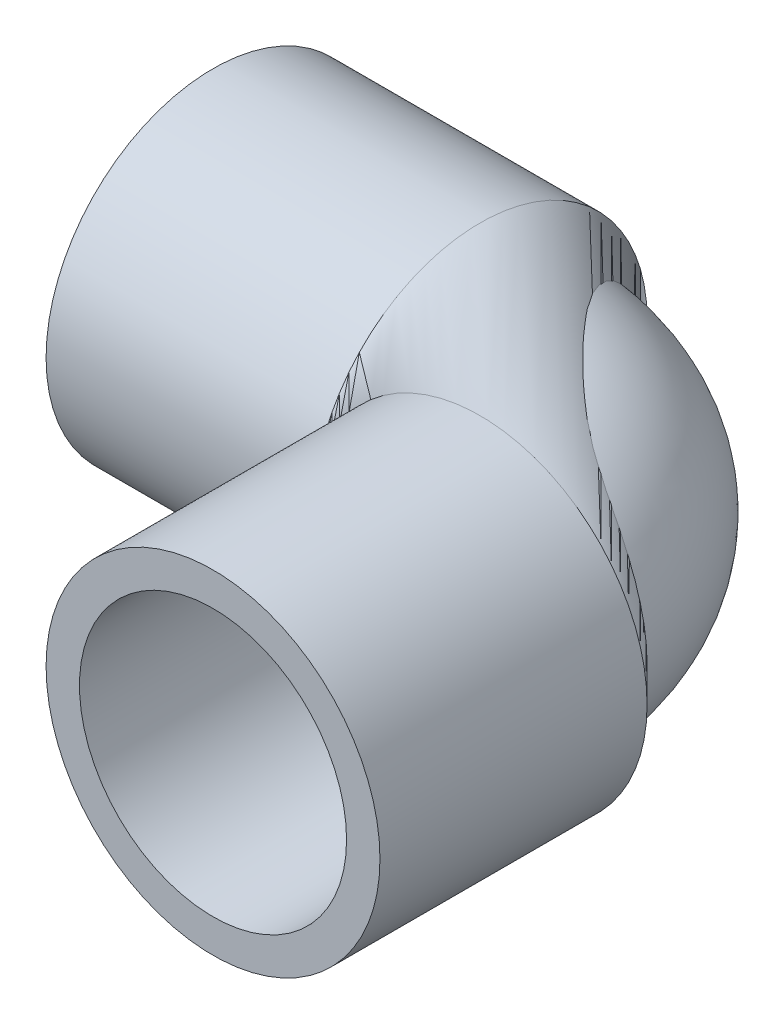
ISO-10303-21;
HEADER;
FILE_DESCRIPTION(('STEP AP214'),'2;1');
FILE_NAME('part.step','',(''),(''),'','','');
FILE_SCHEMA(('AUTOMOTIVE_DESIGN { 1 0 10303 214 1 1 1 1 }'));
ENDSEC;
DATA;
#1=APPLICATION_CONTEXT('core data for automotive mechanical design processes');
#2=APPLICATION_PROTOCOL_DEFINITION('international standard','automotive_design',2000,#1);
#3=PRODUCT_CONTEXT('',#1,'mechanical');
#4=PRODUCT('Part','Part','',(#3));
#5=PRODUCT_RELATED_PRODUCT_CATEGORY('part','',(#4));
#6=PRODUCT_DEFINITION_FORMATION('','',#4);
#7=PRODUCT_DEFINITION_CONTEXT('part definition',#1,'design');
#8=PRODUCT_DEFINITION('design','',#6,#7);
#9=PRODUCT_DEFINITION_SHAPE('','',#8);
#10=(LENGTH_UNIT() NAMED_UNIT(*) SI_UNIT(.MILLI.,.METRE.));
#11=(NAMED_UNIT(*) PLANE_ANGLE_UNIT() SI_UNIT($,.RADIAN.));
#12=(NAMED_UNIT(*) SI_UNIT($,.STERADIAN.) SOLID_ANGLE_UNIT());
#13=UNCERTAINTY_MEASURE_WITH_UNIT(LENGTH_MEASURE(1.E-05),#10,'distance_accuracy_value','');
#14=(GEOMETRIC_REPRESENTATION_CONTEXT(3) GLOBAL_UNCERTAINTY_ASSIGNED_CONTEXT((#13)) GLOBAL_UNIT_ASSIGNED_CONTEXT((#10,
#11,#12)) REPRESENTATION_CONTEXT('',''));
#15=CARTESIAN_POINT('',(0.,0.,0.));
#16=DIRECTION('',(0.,0.,1.));
#17=DIRECTION('',(1.,0.,0.));
#18=AXIS2_PLACEMENT_3D('',#15,#16,#17);
#19=CARTESIAN_POINT('',(-41.2750000000001,0.,-15.8749999999999));
#20=DIRECTION('',(1.,0.,0.));
#21=DIRECTION('',(0.,0.,-1.));
#22=AXIS2_PLACEMENT_3D('',#19,#20,#21);
#23=CYLINDRICAL_SURFACE('',#22,15.875);
#24=CARTESIAN_POINT('',(-41.2750000000001,0.,-15.8749999999999));
#25=DIRECTION('',(1.,0.,0.));
#26=DIRECTION('',(0.,0.,-1.));
#27=AXIS2_PLACEMENT_3D('',#24,#25,#26);
#28=CIRCLE('',#27,15.875);
#29=CARTESIAN_POINT('',(-41.2750000000001,0.,-31.7499999999999));
#30=VERTEX_POINT('',#29);
#31=EDGE_CURVE('E12',#30,#30,#28,.T.);
#32=ORIENTED_EDGE('',*,*,#31,.T.);
#33=EDGE_LOOP('',(#32));
#34=FACE_BOUND('',#33,.T.);
#35=CARTESIAN_POINT('',(-15.8750000000001,0.,-15.875));
#36=DIRECTION('',(1.,0.,0.));
#37=DIRECTION('',(0.,0.,-1.));
#38=AXIS2_PLACEMENT_3D('',#35,#36,#37);
#39=CIRCLE('',#38,15.875);
#40=CARTESIAN_POINT('',(-15.8750000000001,0.,-31.75));
#41=VERTEX_POINT('',#40);
#42=EDGE_CURVE('E53',#41,#41,#39,.T.);
#43=ORIENTED_EDGE('',*,*,#42,.F.);
#44=EDGE_LOOP('',(#43));
#45=FACE_BOUND('',#44,.T.);
#46=ADVANCED_FACE('F50',(#34,#45),#23,.T.);
#47=CARTESIAN_POINT('',(-41.2750000000001,0.,-15.8749999999999));
#48=DIRECTION('',(1.,0.,0.));
#49=DIRECTION('',(0.,0.,-1.));
#50=AXIS2_PLACEMENT_3D('',#47,#48,#49);
#51=PLANE('',#50);
#52=CARTESIAN_POINT('',(-41.2750000000001,0.,-15.8749999999999));
#53=DIRECTION('',(1.,0.,0.));
#54=DIRECTION('',(0.,0.,-1.));
#55=AXIS2_PLACEMENT_3D('',#52,#53,#54);
#56=CIRCLE('',#55,12.7);
#57=CARTESIAN_POINT('',(-41.2750000000001,0.,-28.5749999999999));
#58=VERTEX_POINT('',#57);
#59=EDGE_CURVE('E60',#58,#58,#56,.T.);
#60=ORIENTED_EDGE('',*,*,#59,.T.);
#61=EDGE_LOOP('',(#60));
#62=FACE_BOUND('',#61,.T.);
#63=ORIENTED_EDGE('',*,*,#31,.F.);
#64=EDGE_LOOP('',(#63));
#65=FACE_BOUND('',#64,.T.);
#66=ADVANCED_FACE('F68',(#62,#65),#51,.F.);
#67=CARTESIAN_POINT('',(-15.8750000000001,0.,-15.875));
#68=DIRECTION('',(1.,0.,0.));
#69=DIRECTION('',(0.,0.,-1.));
#70=AXIS2_PLACEMENT_3D('',#67,#68,#69);
#71=PLANE('',#70);
#72=CARTESIAN_POINT('',(-15.8750000000001,0.,-15.875));
#73=DIRECTION('',(1.,0.,0.));
#74=DIRECTION('',(0.,0.,-1.));
#75=AXIS2_PLACEMENT_3D('',#72,#73,#74);
#76=CIRCLE('',#75,12.7);
#77=CARTESIAN_POINT('',(-15.8750000000001,0.,-28.575));
#78=VERTEX_POINT('',#77);
#79=EDGE_CURVE('E62',#78,#78,#76,.T.);
#80=ORIENTED_EDGE('',*,*,#79,.F.);
#81=EDGE_LOOP('',(#80));
#82=FACE_BOUND('',#81,.T.);
#83=ORIENTED_EDGE('',*,*,#42,.T.);
#84=EDGE_LOOP('',(#83));
#85=FACE_BOUND('',#84,.T.);
#86=ADVANCED_FACE('F74',(#82,#85),#71,.T.);
#87=CARTESIAN_POINT('',(-41.2750000000001,0.,-15.8749999999999));
#88=DIRECTION('',(1.,0.,0.));
#89=DIRECTION('',(0.,0.,-1.));
#90=AXIS2_PLACEMENT_3D('',#87,#88,#89);
#91=CYLINDRICAL_SURFACE('',#90,12.7);
#92=ORIENTED_EDGE('',*,*,#59,.F.);
#93=EDGE_LOOP('',(#92));
#94=FACE_BOUND('',#93,.T.);
#95=ORIENTED_EDGE('',*,*,#79,.T.);
#96=EDGE_LOOP('',(#95));
#97=FACE_BOUND('',#96,.T.);
#98=ADVANCED_FACE('F71',(#94,#97),#91,.F.);
#99=CLOSED_SHELL('',(#46,#66,#86,#98));
#100=MANIFOLD_SOLID_BREP('B2',#99);
#101=CARTESIAN_POINT('',(0.,0.,0.));
#102=DIRECTION('',(0.,0.,-1.));
#103=DIRECTION('',(-1.,0.,0.));
#104=AXIS2_PLACEMENT_3D('',#101,#102,#103);
#105=PLANE('',#104);
#106=CARTESIAN_POINT('',(0.,0.,0.));
#107=DIRECTION('',(0.,0.,-1.));
#108=DIRECTION('',(-1.,0.,0.));
#109=AXIS2_PLACEMENT_3D('',#106,#107,#108);
#110=CIRCLE('',#109,12.7);
#111=CARTESIAN_POINT('',(-12.7,0.,0.));
#112=VERTEX_POINT('',#111);
#113=EDGE_CURVE('E124',#112,#112,#110,.T.);
#114=ORIENTED_EDGE('',*,*,#113,.F.);
#115=EDGE_LOOP('',(#114));
#116=FACE_BOUND('',#115,.T.);
#117=CARTESIAN_POINT('',(0.,0.,0.));
#118=DIRECTION('',(0.,0.,-1.));
#119=DIRECTION('',(-1.,0.,0.));
#120=AXIS2_PLACEMENT_3D('',#117,#118,#119);
#121=CIRCLE('',#120,15.875);
#122=CARTESIAN_POINT('',(-15.875,0.,0.));
#123=VERTEX_POINT('',#122);
#124=EDGE_CURVE('E49',#123,#123,#121,.T.);
#125=ORIENTED_EDGE('',*,*,#124,.T.);
#126=EDGE_LOOP('',(#125));
#127=FACE_BOUND('',#126,.T.);
#128=ADVANCED_FACE('F120',(#116,#127),#105,.T.);
#129=OPEN_SHELL('',(#128));
#130=SHELL_BASED_SURFACE_MODEL('B7',(#129));
#131=CARTESIAN_POINT('',(-15.875,0.,0.));
#132=DIRECTION('',(1.,0.,0.));
#133=DIRECTION('',(0.,0.,-1.));
#134=AXIS2_PLACEMENT_3D('',#131,#132,#133);
#135=PLANE('',#134);
#136=CARTESIAN_POINT('',(-15.8750000000001,0.,-15.875));
#137=DIRECTION('',(1.,0.,0.));
#138=DIRECTION('',(0.,0.,-1.));
#139=AXIS2_PLACEMENT_3D('',#136,#137,#138);
#140=CIRCLE('',#139,15.875);
#141=CARTESIAN_POINT('',(-15.8750000000001,0.,-31.75));
#142=VERTEX_POINT('',#141);
#143=EDGE_CURVE('E157',#142,#142,#140,.F.);
#144=ORIENTED_EDGE('',*,*,#143,.F.);
#145=EDGE_LOOP('',(#144));
#146=FACE_BOUND('',#145,.T.);
#147=CARTESIAN_POINT('',(-15.8750000000001,0.,-15.875));
#148=DIRECTION('',(1.,0.,0.));
#149=DIRECTION('',(0.,0.,-1.));
#150=AXIS2_PLACEMENT_3D('',#147,#148,#149);
#151=CIRCLE('',#150,12.7);
#152=CARTESIAN_POINT('',(-15.8750000000001,0.,-28.575));
#153=VERTEX_POINT('',#152);
#154=EDGE_CURVE('E119',#153,#153,#151,.F.);
#155=ORIENTED_EDGE('',*,*,#154,.T.);
#156=EDGE_LOOP('',(#155));
#157=FACE_BOUND('',#156,.T.);
#158=ADVANCED_FACE('F153',(#146,#157),#135,.T.);
#159=OPEN_SHELL('',(#158));
#160=SHELL_BASED_SURFACE_MODEL('B44',(#159));
#161=CARTESIAN_POINT('',(-15.875,0.,0.));
#162=DIRECTION('',(0.,1.,0.));
#163=DIRECTION('',(0.,0.,1.));
#164=AXIS2_PLACEMENT_3D('',#161,#162,#163);
#165=TOROIDAL_SURFACE('',#164,15.875,12.7);
#166=CARTESIAN_POINT('',(0.,0.,0.));
#167=DIRECTION('',(0.,0.,-1.));
#168=DIRECTION('',(-1.,0.,0.));
#169=AXIS2_PLACEMENT_3D('',#166,#167,#168);
#170=CIRCLE('',#169,12.7);
#171=CARTESIAN_POINT('',(12.7,0.,0.));
#172=VERTEX_POINT('',#171);
#173=EDGE_CURVE('E192',#172,#172,#170,.T.);
#174=CARTESIAN_POINT('',(-15.8750000000001,0.,-15.875));
#175=DIRECTION('',(-1.,0.,0.));
#176=DIRECTION('',(0.,0.,1.));
#177=AXIS2_PLACEMENT_3D('',#174,#175,#176);
#178=CIRCLE('',#177,12.7);
#179=CARTESIAN_POINT('',(-15.8750000000001,0.,-28.575));
#180=VERTEX_POINT('',#179);
#181=EDGE_CURVE('E152',#180,#180,#178,.T.);
#182=CARTESIAN_POINT('',(-15.875,0.,0.));
#183=DIRECTION('',(0.,1.,0.));
#184=DIRECTION('',(0.,0.,1.));
#185=AXIS2_PLACEMENT_3D('',#182,#183,#184);
#186=CIRCLE('',#185,28.575);
#187=EDGE_CURVE('',#172,#180,#186,.T.);
#188=ORIENTED_EDGE('',*,*,#173,.T.);
#189=ORIENTED_EDGE('',*,*,#181,.F.);
#190=ORIENTED_EDGE('',*,*,#187,.T.);
#191=ORIENTED_EDGE('',*,*,#187,.F.);
#192=EDGE_LOOP('',(#188,#190,#189,#191));
#193=FACE_BOUND('',#192,.T.);
#194=ADVANCED_FACE('F188',(#193),#165,.T.);
#195=OPEN_SHELL('',(#194));
#196=SHELL_BASED_SURFACE_MODEL('B114',(#195));
#197=CARTESIAN_POINT('',(-15.875,0.,0.));
#198=DIRECTION('',(0.,1.,0.));
#199=DIRECTION('',(0.,0.,1.));
#200=AXIS2_PLACEMENT_3D('',#197,#198,#199);
#201=DEGENERATE_TOROIDAL_SURFACE('',#200,15.875,15.875,.T.);
#202=CARTESIAN_POINT('',(-15.8750000000001,0.,-15.875));
#203=DIRECTION('',(-1.,0.,0.));
#204=DIRECTION('',(0.,0.,1.));
#205=AXIS2_PLACEMENT_3D('',#202,#203,#204);
#206=CIRCLE('',#205,15.875);
#207=CARTESIAN_POINT('',(-15.875,0.,0.));
#208=VERTEX_POINT('',#207);
#209=EDGE_CURVE('E223',#208,#208,#206,.T.);
#210=ORIENTED_EDGE('',*,*,#209,.F.);
#211=CARTESIAN_POINT('',(0.,0.,0.));
#212=DIRECTION('',(0.,0.,-1.));
#213=DIRECTION('',(-1.,0.,0.));
#214=AXIS2_PLACEMENT_3D('',#211,#212,#213);
#215=CIRCLE('',#214,15.875);
#216=EDGE_CURVE('E186',#208,#208,#215,.T.);
#217=ORIENTED_EDGE('',*,*,#216,.T.);
#218=EDGE_LOOP('',(#210,#217));
#219=FACE_BOUND('',#218,.T.);
#220=ADVANCED_FACE('F222',(#219),#201,.T.);
#221=OPEN_SHELL('',(#220));
#222=SHELL_BASED_SURFACE_MODEL('B147',(#221));
#223=CARTESIAN_POINT('',(0.,0.,25.4));
#224=DIRECTION('',(0.,0.,-1.));
#225=DIRECTION('',(-1.,0.,0.));
#226=AXIS2_PLACEMENT_3D('',#223,#224,#225);
#227=CYLINDRICAL_SURFACE('',#226,12.7);
#228=CARTESIAN_POINT('',(0.,0.,25.4));
#229=DIRECTION('',(0.,0.,1.));
#230=DIRECTION('',(1.,0.,0.));
#231=AXIS2_PLACEMENT_3D('',#228,#229,#230);
#232=CIRCLE('',#231,12.7);
#233=CARTESIAN_POINT('',(12.7,0.,25.4));
#234=VERTEX_POINT('',#233);
#235=EDGE_CURVE('E253',#234,#234,#232,.T.);
#236=ORIENTED_EDGE('',*,*,#235,.T.);
#237=EDGE_LOOP('',(#236));
#238=FACE_BOUND('',#237,.T.);
#239=CARTESIAN_POINT('',(0.,0.,0.));
#240=DIRECTION('',(0.,0.,1.));
#241=DIRECTION('',(1.,0.,0.));
#242=AXIS2_PLACEMENT_3D('',#239,#240,#241);
#243=CIRCLE('',#242,12.7);
#244=CARTESIAN_POINT('',(12.7,0.,0.));
#245=VERTEX_POINT('',#244);
#246=EDGE_CURVE('E260',#245,#245,#243,.T.);
#247=ORIENTED_EDGE('',*,*,#246,.F.);
#248=EDGE_LOOP('',(#247));
#249=FACE_BOUND('',#248,.T.);
#250=ADVANCED_FACE('F246',(#238,#249),#227,.F.);
#251=CARTESIAN_POINT('',(0.,0.,25.4));
#252=DIRECTION('',(0.,0.,-1.));
#253=DIRECTION('',(-1.,0.,0.));
#254=AXIS2_PLACEMENT_3D('',#251,#252,#253);
#255=CYLINDRICAL_SURFACE('',#254,15.875);
#256=CARTESIAN_POINT('',(0.,0.,25.4));
#257=DIRECTION('',(0.,0.,1.));
#258=DIRECTION('',(1.,0.,0.));
#259=AXIS2_PLACEMENT_3D('',#256,#257,#258);
#260=CIRCLE('',#259,15.875);
#261=CARTESIAN_POINT('',(15.875,0.,25.4));
#262=VERTEX_POINT('',#261);
#263=EDGE_CURVE('E220',#262,#262,#260,.T.);
#264=ORIENTED_EDGE('',*,*,#263,.F.);
#265=EDGE_LOOP('',(#264));
#266=FACE_BOUND('',#265,.T.);
#267=CARTESIAN_POINT('',(0.,0.,0.));
#268=DIRECTION('',(0.,0.,1.));
#269=DIRECTION('',(1.,0.,0.));
#270=AXIS2_PLACEMENT_3D('',#267,#268,#269);
#271=CIRCLE('',#270,15.875);
#272=CARTESIAN_POINT('',(-15.875,0.,0.));
#273=VERTEX_POINT('',#272);
#274=EDGE_CURVE('E249',#273,#273,#271,.T.);
#275=ORIENTED_EDGE('',*,*,#274,.T.);
#276=EDGE_LOOP('',(#275));
#277=FACE_BOUND('',#276,.T.);
#278=ADVANCED_FACE('F258',(#266,#277),#255,.T.);
#279=CARTESIAN_POINT('',(0.,0.,25.4));
#280=DIRECTION('',(0.,0.,1.));
#281=DIRECTION('',(1.,0.,0.));
#282=AXIS2_PLACEMENT_3D('',#279,#280,#281);
#283=PLANE('',#282);
#284=ORIENTED_EDGE('',*,*,#235,.F.);
#285=EDGE_LOOP('',(#284));
#286=FACE_BOUND('',#285,.T.);
#287=ORIENTED_EDGE('',*,*,#263,.T.);
#288=EDGE_LOOP('',(#287));
#289=FACE_BOUND('',#288,.T.);
#290=ADVANCED_FACE('F273',(#286,#289),#283,.T.);
#291=CARTESIAN_POINT('',(0.,0.,0.));
#292=DIRECTION('',(0.,0.,1.));
#293=DIRECTION('',(1.,0.,0.));
#294=AXIS2_PLACEMENT_3D('',#291,#292,#293);
#295=PLANE('',#294);
#296=ORIENTED_EDGE('',*,*,#246,.T.);
#297=EDGE_LOOP('',(#296));
#298=FACE_BOUND('',#297,.T.);
#299=ORIENTED_EDGE('',*,*,#274,.F.);
#300=EDGE_LOOP('',(#299));
#301=FACE_BOUND('',#300,.T.);
#302=ADVANCED_FACE('F266',(#298,#301),#295,.F.);
#303=CLOSED_SHELL('',(#250,#278,#290,#302));
#304=MANIFOLD_SOLID_BREP('B180',#303);
#305=ADVANCED_BREP_SHAPE_REPRESENTATION('',(#18,#100,#304),#14);
#306=MANIFOLD_SURFACE_SHAPE_REPRESENTATION('',(#18,#130,#160,#196,#222),#14);
#307=SHAPE_REPRESENTATION('',(#18),#14);
#308=SHAPE_DEFINITION_REPRESENTATION(#9,#307);
#309=SHAPE_REPRESENTATION_RELATIONSHIP('','',#307,#305);
#310=SHAPE_REPRESENTATION_RELATIONSHIP('','',#307,#306);
ENDSEC;
END-ISO-10303-21;
